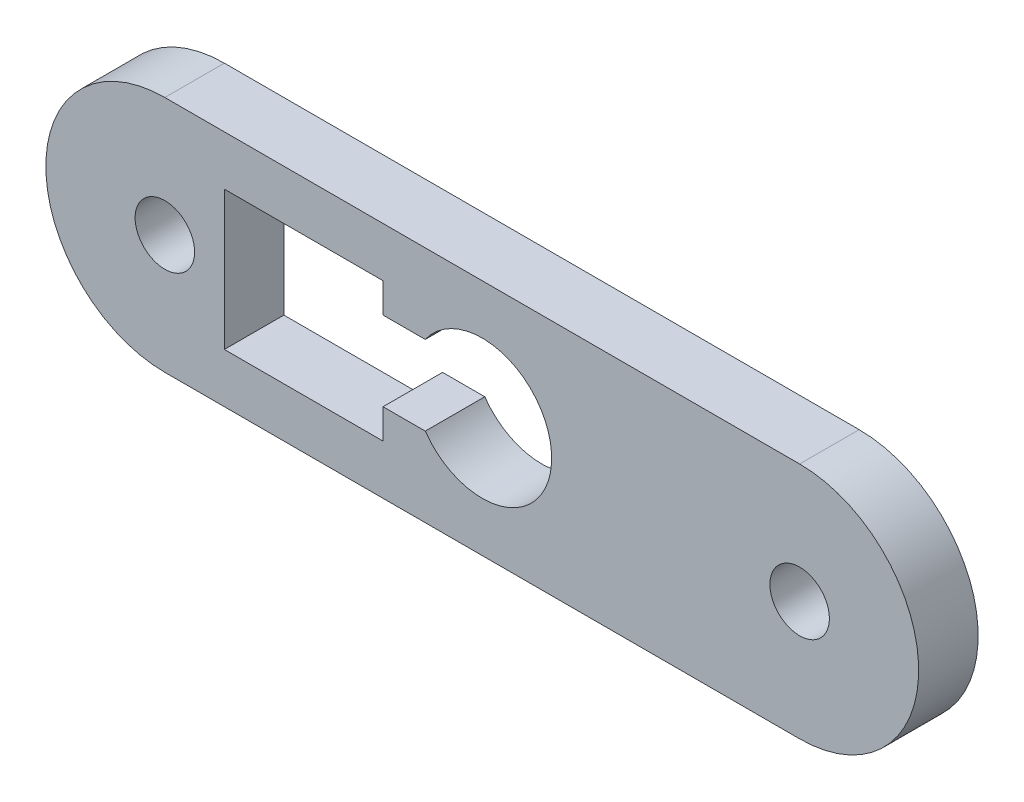
ISO-10303-21;
HEADER;
FILE_DESCRIPTION(('STEP AP214'),'2;1');
FILE_NAME('part.step','',(''),(''),'','','');
FILE_SCHEMA(('AUTOMOTIVE_DESIGN { 1 0 10303 214 1 1 1 1 }'));
ENDSEC;
DATA;
#1=APPLICATION_CONTEXT('core data for automotive mechanical design processes');
#2=APPLICATION_PROTOCOL_DEFINITION('international standard','automotive_design',2000,#1);
#3=PRODUCT_CONTEXT('',#1,'mechanical');
#4=PRODUCT('Part','Part','',(#3));
#5=PRODUCT_RELATED_PRODUCT_CATEGORY('part','',(#4));
#6=PRODUCT_DEFINITION_FORMATION('','',#4);
#7=PRODUCT_DEFINITION_CONTEXT('part definition',#1,'design');
#8=PRODUCT_DEFINITION('design','',#6,#7);
#9=PRODUCT_DEFINITION_SHAPE('','',#8);
#10=(LENGTH_UNIT() NAMED_UNIT(*) SI_UNIT(.MILLI.,.METRE.));
#11=(NAMED_UNIT(*) PLANE_ANGLE_UNIT() SI_UNIT($,.RADIAN.));
#12=(NAMED_UNIT(*) SI_UNIT($,.STERADIAN.) SOLID_ANGLE_UNIT());
#13=UNCERTAINTY_MEASURE_WITH_UNIT(LENGTH_MEASURE(1.E-05),#10,'distance_accuracy_value','');
#14=(GEOMETRIC_REPRESENTATION_CONTEXT(3) GLOBAL_UNCERTAINTY_ASSIGNED_CONTEXT((#13)) GLOBAL_UNIT_ASSIGNED_CONTEXT((#10,
#11,#12)) REPRESENTATION_CONTEXT('',''));
#15=CARTESIAN_POINT('',(0.,0.,0.));
#16=DIRECTION('',(0.,0.,1.));
#17=DIRECTION('',(1.,0.,0.));
#18=AXIS2_PLACEMENT_3D('',#15,#16,#17);
#19=CARTESIAN_POINT('',(0.,6.,3.));
#20=DIRECTION('',(0.,0.,1.));
#21=DIRECTION('',(1.,0.,0.));
#22=AXIS2_PLACEMENT_3D('',#19,#20,#21);
#23=PLANE('',#22);
#24=DIRECTION('',(0.,-1.,0.));
#25=VECTOR('',#24,1.);
#26=CARTESIAN_POINT('',(3.,9.5,3.));
#27=LINE('',#26,#25);
#28=CARTESIAN_POINT('',(3.,9.5,3.));
#29=VERTEX_POINT('',#28);
#30=CARTESIAN_POINT('',(3.,2.5,3.));
#31=VERTEX_POINT('',#30);
#32=EDGE_CURVE('E47',#29,#31,#27,.T.);
#33=ORIENTED_EDGE('',*,*,#32,.F.);
#34=DIRECTION('',(-1.,0.,0.));
#35=VECTOR('',#34,1.);
#36=CARTESIAN_POINT('',(3.,9.5,3.));
#37=LINE('',#36,#35);
#38=CARTESIAN_POINT('',(11.,9.5,3.));
#39=VERTEX_POINT('',#38);
#40=EDGE_CURVE('E140',#39,#29,#37,.T.);
#41=ORIENTED_EDGE('',*,*,#40,.F.);
#42=DIRECTION('',(0.,1.,0.));
#43=VECTOR('',#42,1.);
#44=CARTESIAN_POINT('',(11.,9.5,3.));
#45=LINE('',#44,#43);
#46=CARTESIAN_POINT('',(11.,8.,3.));
#47=VERTEX_POINT('',#46);
#48=EDGE_CURVE('E143',#47,#39,#45,.T.);
#49=ORIENTED_EDGE('',*,*,#48,.F.);
#50=DIRECTION('',(-1.,0.,0.));
#51=VECTOR('',#50,1.);
#52=CARTESIAN_POINT('',(11.,8.,3.));
#53=LINE('',#52,#51);
#54=CARTESIAN_POINT('',(13.127718676731,8.,3.));
#55=VERTEX_POINT('',#54);
#56=EDGE_CURVE('E171',#55,#47,#53,.T.);
#57=ORIENTED_EDGE('',*,*,#56,.F.);
#58=CARTESIAN_POINT('',(16.,6.,3.));
#59=DIRECTION('',(0.,0.,1.));
#60=DIRECTION('',(1.,0.,0.));
#61=AXIS2_PLACEMENT_3D('',#58,#59,#60);
#62=CIRCLE('',#61,3.5);
#63=CARTESIAN_POINT('',(13.127718676731,4.,3.));
#64=VERTEX_POINT('',#63);
#65=EDGE_CURVE('E168',#64,#55,#62,.T.);
#66=ORIENTED_EDGE('',*,*,#65,.F.);
#67=DIRECTION('',(1.,0.,0.));
#68=VECTOR('',#67,1.);
#69=CARTESIAN_POINT('',(11.,4.,3.));
#70=LINE('',#69,#68);
#71=CARTESIAN_POINT('',(11.,4.,3.));
#72=VERTEX_POINT('',#71);
#73=EDGE_CURVE('E165',#72,#64,#70,.T.);
#74=ORIENTED_EDGE('',*,*,#73,.F.);
#75=DIRECTION('',(0.,1.,0.));
#76=VECTOR('',#75,1.);
#77=CARTESIAN_POINT('',(11.,4.,3.));
#78=LINE('',#77,#76);
#79=CARTESIAN_POINT('',(11.,2.5,3.));
#80=VERTEX_POINT('',#79);
#81=EDGE_CURVE('E162',#80,#72,#78,.T.);
#82=ORIENTED_EDGE('',*,*,#81,.F.);
#83=DIRECTION('',(1.,0.,0.));
#84=VECTOR('',#83,1.);
#85=CARTESIAN_POINT('',(3.,2.5,3.));
#86=LINE('',#85,#84);
#87=EDGE_CURVE('E160',#31,#80,#86,.T.);
#88=ORIENTED_EDGE('',*,*,#87,.F.);
#89=EDGE_LOOP('',(#33,#41,#49,#57,#66,#74,#82,#88));
#90=FACE_BOUND('',#89,.T.);
#91=CARTESIAN_POINT('',(0.,6.,3.));
#92=DIRECTION('',(0.,0.,1.));
#93=DIRECTION('',(1.,0.,0.));
#94=AXIS2_PLACEMENT_3D('',#91,#92,#93);
#95=CIRCLE('',#94,1.5);
#96=CARTESIAN_POINT('',(1.5,6.,3.));
#97=VERTEX_POINT('',#96);
#98=EDGE_CURVE('E196',#97,#97,#95,.T.);
#99=ORIENTED_EDGE('',*,*,#98,.F.);
#100=EDGE_LOOP('',(#99));
#101=FACE_BOUND('',#100,.T.);
#102=CARTESIAN_POINT('',(0.,6.,3.));
#103=DIRECTION('',(0.,0.,1.));
#104=DIRECTION('',(1.,0.,0.));
#105=AXIS2_PLACEMENT_3D('',#102,#103,#104);
#106=CIRCLE('',#105,6.);
#107=CARTESIAN_POINT('',(0.,12.,3.));
#108=VERTEX_POINT('',#107);
#109=CARTESIAN_POINT('',(0.,0.,3.));
#110=VERTEX_POINT('',#109);
#111=EDGE_CURVE('E202',#108,#110,#106,.T.);
#112=ORIENTED_EDGE('',*,*,#111,.T.);
#113=DIRECTION('',(1.,0.,0.));
#114=VECTOR('',#113,1.);
#115=CARTESIAN_POINT('',(0.,0.,3.));
#116=LINE('',#115,#114);
#117=CARTESIAN_POINT('',(32.,0.,3.));
#118=VERTEX_POINT('',#117);
#119=EDGE_CURVE('E205',#110,#118,#116,.T.);
#120=ORIENTED_EDGE('',*,*,#119,.T.);
#121=CARTESIAN_POINT('',(32.,6.,3.));
#122=DIRECTION('',(0.,0.,1.));
#123=DIRECTION('',(-1.,0.,0.));
#124=AXIS2_PLACEMENT_3D('',#121,#122,#123);
#125=CIRCLE('',#124,6.);
#126=CARTESIAN_POINT('',(32.,12.,3.));
#127=VERTEX_POINT('',#126);
#128=EDGE_CURVE('E208',#118,#127,#125,.T.);
#129=ORIENTED_EDGE('',*,*,#128,.T.);
#130=DIRECTION('',(-1.,0.,0.));
#131=VECTOR('',#130,1.);
#132=CARTESIAN_POINT('',(0.,12.,3.));
#133=LINE('',#132,#131);
#134=EDGE_CURVE('E210',#127,#108,#133,.T.);
#135=ORIENTED_EDGE('',*,*,#134,.T.);
#136=EDGE_LOOP('',(#112,#120,#129,#135));
#137=FACE_BOUND('',#136,.T.);
#138=CARTESIAN_POINT('',(32.,6.,3.));
#139=DIRECTION('',(0.,0.,1.));
#140=DIRECTION('',(1.,0.,0.));
#141=AXIS2_PLACEMENT_3D('',#138,#139,#140);
#142=CIRCLE('',#141,1.5);
#143=CARTESIAN_POINT('',(33.5,6.,3.));
#144=VERTEX_POINT('',#143);
#145=EDGE_CURVE('E190',#144,#144,#142,.T.);
#146=ORIENTED_EDGE('',*,*,#145,.F.);
#147=EDGE_LOOP('',(#146));
#148=FACE_BOUND('',#147,.T.);
#149=ADVANCED_FACE('F32',(#90,#101,#137,#148),#23,.T.);
#150=CARTESIAN_POINT('',(0.,6.,0.));
#151=DIRECTION('',(0.,0.,1.));
#152=DIRECTION('',(1.,0.,0.));
#153=AXIS2_PLACEMENT_3D('',#150,#151,#152);
#154=PLANE('',#153);
#155=DIRECTION('',(-1.,0.,0.));
#156=VECTOR('',#155,1.);
#157=CARTESIAN_POINT('',(3.,9.5,0.));
#158=LINE('',#157,#156);
#159=CARTESIAN_POINT('',(11.,9.5,0.));
#160=VERTEX_POINT('',#159);
#161=CARTESIAN_POINT('',(3.,9.5,0.));
#162=VERTEX_POINT('',#161);
#163=EDGE_CURVE('E129',#160,#162,#158,.T.);
#164=ORIENTED_EDGE('',*,*,#163,.T.);
#165=DIRECTION('',(0.,-1.,0.));
#166=VECTOR('',#165,1.);
#167=CARTESIAN_POINT('',(3.,9.5,0.));
#168=LINE('',#167,#166);
#169=CARTESIAN_POINT('',(3.,2.5,0.));
#170=VERTEX_POINT('',#169);
#171=EDGE_CURVE('E123',#162,#170,#168,.T.);
#172=ORIENTED_EDGE('',*,*,#171,.T.);
#173=DIRECTION('',(1.,0.,0.));
#174=VECTOR('',#173,1.);
#175=CARTESIAN_POINT('',(3.,2.5,0.));
#176=LINE('',#175,#174);
#177=CARTESIAN_POINT('',(11.,2.5,0.));
#178=VERTEX_POINT('',#177);
#179=EDGE_CURVE('E132',#170,#178,#176,.T.);
#180=ORIENTED_EDGE('',*,*,#179,.T.);
#181=DIRECTION('',(0.,1.,0.));
#182=VECTOR('',#181,1.);
#183=CARTESIAN_POINT('',(11.,4.,0.));
#184=LINE('',#183,#182);
#185=CARTESIAN_POINT('',(11.,4.,0.));
#186=VERTEX_POINT('',#185);
#187=EDGE_CURVE('E55',#178,#186,#184,.T.);
#188=ORIENTED_EDGE('',*,*,#187,.T.);
#189=DIRECTION('',(1.,0.,0.));
#190=VECTOR('',#189,1.);
#191=CARTESIAN_POINT('',(11.,4.,0.));
#192=LINE('',#191,#190);
#193=CARTESIAN_POINT('',(13.127718676731,4.,0.));
#194=VERTEX_POINT('',#193);
#195=EDGE_CURVE('E147',#186,#194,#192,.T.);
#196=ORIENTED_EDGE('',*,*,#195,.T.);
#197=CARTESIAN_POINT('',(16.,6.,0.));
#198=DIRECTION('',(0.,0.,1.));
#199=DIRECTION('',(1.,0.,0.));
#200=AXIS2_PLACEMENT_3D('',#197,#198,#199);
#201=CIRCLE('',#200,3.5);
#202=CARTESIAN_POINT('',(13.127718676731,8.,0.));
#203=VERTEX_POINT('',#202);
#204=EDGE_CURVE('E150',#194,#203,#201,.T.);
#205=ORIENTED_EDGE('',*,*,#204,.T.);
#206=DIRECTION('',(-1.,0.,0.));
#207=VECTOR('',#206,1.);
#208=CARTESIAN_POINT('',(11.,8.,0.));
#209=LINE('',#208,#207);
#210=CARTESIAN_POINT('',(11.,8.,0.));
#211=VERTEX_POINT('',#210);
#212=EDGE_CURVE('E153',#203,#211,#209,.T.);
#213=ORIENTED_EDGE('',*,*,#212,.T.);
#214=DIRECTION('',(0.,1.,0.));
#215=VECTOR('',#214,1.);
#216=CARTESIAN_POINT('',(11.,9.5,0.));
#217=LINE('',#216,#215);
#218=EDGE_CURVE('E156',#211,#160,#217,.T.);
#219=ORIENTED_EDGE('',*,*,#218,.T.);
#220=EDGE_LOOP('',(#164,#172,#180,#188,#196,#205,#213,#219));
#221=FACE_BOUND('',#220,.T.);
#222=CARTESIAN_POINT('',(0.,6.,0.));
#223=DIRECTION('',(0.,0.,1.));
#224=DIRECTION('',(1.,0.,0.));
#225=AXIS2_PLACEMENT_3D('',#222,#223,#224);
#226=CIRCLE('',#225,6.);
#227=CARTESIAN_POINT('',(0.,12.,0.));
#228=VERTEX_POINT('',#227);
#229=CARTESIAN_POINT('',(0.,0.,0.));
#230=VERTEX_POINT('',#229);
#231=EDGE_CURVE('E199',#228,#230,#226,.T.);
#232=ORIENTED_EDGE('',*,*,#231,.F.);
#233=DIRECTION('',(-1.,0.,0.));
#234=VECTOR('',#233,1.);
#235=CARTESIAN_POINT('',(0.,12.,0.));
#236=LINE('',#235,#234);
#237=CARTESIAN_POINT('',(32.,12.,0.));
#238=VERTEX_POINT('',#237);
#239=EDGE_CURVE('E206',#238,#228,#236,.T.);
#240=ORIENTED_EDGE('',*,*,#239,.F.);
#241=CARTESIAN_POINT('',(32.,6.,0.));
#242=DIRECTION('',(0.,0.,1.));
#243=DIRECTION('',(-1.,0.,0.));
#244=AXIS2_PLACEMENT_3D('',#241,#242,#243);
#245=CIRCLE('',#244,6.);
#246=CARTESIAN_POINT('',(32.,0.,0.));
#247=VERTEX_POINT('',#246);
#248=EDGE_CURVE('E217',#247,#238,#245,.T.);
#249=ORIENTED_EDGE('',*,*,#248,.F.);
#250=DIRECTION('',(1.,0.,0.));
#251=VECTOR('',#250,1.);
#252=CARTESIAN_POINT('',(0.,0.,0.));
#253=LINE('',#252,#251);
#254=EDGE_CURVE('E215',#230,#247,#253,.T.);
#255=ORIENTED_EDGE('',*,*,#254,.F.);
#256=EDGE_LOOP('',(#232,#240,#249,#255));
#257=FACE_BOUND('',#256,.T.);
#258=CARTESIAN_POINT('',(0.,6.,0.));
#259=DIRECTION('',(0.,0.,1.));
#260=DIRECTION('',(1.,0.,0.));
#261=AXIS2_PLACEMENT_3D('',#258,#259,#260);
#262=CIRCLE('',#261,1.5);
#263=CARTESIAN_POINT('',(1.5,6.,0.));
#264=VERTEX_POINT('',#263);
#265=EDGE_CURVE('E193',#264,#264,#262,.T.);
#266=ORIENTED_EDGE('',*,*,#265,.T.);
#267=EDGE_LOOP('',(#266));
#268=FACE_BOUND('',#267,.T.);
#269=CARTESIAN_POINT('',(32.,6.,0.));
#270=DIRECTION('',(0.,0.,1.));
#271=DIRECTION('',(1.,0.,0.));
#272=AXIS2_PLACEMENT_3D('',#269,#270,#271);
#273=CIRCLE('',#272,1.5);
#274=CARTESIAN_POINT('',(33.5,6.,0.));
#275=VERTEX_POINT('',#274);
#276=EDGE_CURVE('E178',#275,#275,#273,.T.);
#277=ORIENTED_EDGE('',*,*,#276,.T.);
#278=EDGE_LOOP('',(#277));
#279=FACE_BOUND('',#278,.T.);
#280=ADVANCED_FACE('F136',(#221,#257,#268,#279),#154,.F.);
#281=CARTESIAN_POINT('',(0.,6.,3.));
#282=DIRECTION('',(0.,0.,-1.));
#283=DIRECTION('',(-1.,0.,0.));
#284=AXIS2_PLACEMENT_3D('',#281,#282,#283);
#285=CYLINDRICAL_SURFACE('',#284,6.);
#286=ORIENTED_EDGE('',*,*,#231,.T.);
#287=DIRECTION('',(0.,0.,-1.));
#288=VECTOR('',#287,1.);
#289=CARTESIAN_POINT('',(0.,0.,3.));
#290=LINE('',#289,#288);
#291=EDGE_CURVE('E11',#110,#230,#290,.T.);
#292=ORIENTED_EDGE('',*,*,#291,.F.);
#293=ORIENTED_EDGE('',*,*,#111,.F.);
#294=DIRECTION('',(0.,0.,-1.));
#295=VECTOR('',#294,1.);
#296=CARTESIAN_POINT('',(0.,12.,3.));
#297=LINE('',#296,#295);
#298=EDGE_CURVE('E212',#108,#228,#297,.T.);
#299=ORIENTED_EDGE('',*,*,#298,.T.);
#300=EDGE_LOOP('',(#286,#292,#293,#299));
#301=FACE_BOUND('',#300,.T.);
#302=ADVANCED_FACE('F34',(#301),#285,.T.);
#303=CARTESIAN_POINT('',(0.,0.,3.));
#304=DIRECTION('',(0.,1.,0.));
#305=DIRECTION('',(0.,0.,1.));
#306=AXIS2_PLACEMENT_3D('',#303,#304,#305);
#307=PLANE('',#306);
#308=ORIENTED_EDGE('',*,*,#254,.T.);
#309=DIRECTION('',(0.,0.,-1.));
#310=VECTOR('',#309,1.);
#311=CARTESIAN_POINT('',(32.,0.,3.));
#312=LINE('',#311,#310);
#313=EDGE_CURVE('E40',#118,#247,#312,.T.);
#314=ORIENTED_EDGE('',*,*,#313,.F.);
#315=ORIENTED_EDGE('',*,*,#119,.F.);
#316=ORIENTED_EDGE('',*,*,#291,.T.);
#317=EDGE_LOOP('',(#308,#314,#315,#316));
#318=FACE_BOUND('',#317,.T.);
#319=ADVANCED_FACE('F244',(#318),#307,.F.);
#320=CARTESIAN_POINT('',(32.,6.,3.));
#321=DIRECTION('',(0.,0.,-1.));
#322=DIRECTION('',(-1.,0.,0.));
#323=AXIS2_PLACEMENT_3D('',#320,#321,#322);
#324=CYLINDRICAL_SURFACE('',#323,6.);
#325=ORIENTED_EDGE('',*,*,#248,.T.);
#326=DIRECTION('',(0.,0.,-1.));
#327=VECTOR('',#326,1.);
#328=CARTESIAN_POINT('',(32.,12.,3.));
#329=LINE('',#328,#327);
#330=EDGE_CURVE('E222',#127,#238,#329,.T.);
#331=ORIENTED_EDGE('',*,*,#330,.F.);
#332=ORIENTED_EDGE('',*,*,#128,.F.);
#333=ORIENTED_EDGE('',*,*,#313,.T.);
#334=EDGE_LOOP('',(#325,#331,#332,#333));
#335=FACE_BOUND('',#334,.T.);
#336=ADVANCED_FACE('F229',(#335),#324,.T.);
#337=CARTESIAN_POINT('',(0.,12.,3.));
#338=DIRECTION('',(0.,-1.,0.));
#339=DIRECTION('',(0.,0.,-1.));
#340=AXIS2_PLACEMENT_3D('',#337,#338,#339);
#341=PLANE('',#340);
#342=ORIENTED_EDGE('',*,*,#239,.T.);
#343=ORIENTED_EDGE('',*,*,#298,.F.);
#344=ORIENTED_EDGE('',*,*,#134,.F.);
#345=ORIENTED_EDGE('',*,*,#330,.T.);
#346=EDGE_LOOP('',(#342,#343,#344,#345));
#347=FACE_BOUND('',#346,.T.);
#348=ADVANCED_FACE('F237',(#347),#341,.F.);
#349=CARTESIAN_POINT('',(0.,6.,3.));
#350=DIRECTION('',(0.,0.,-1.));
#351=DIRECTION('',(-1.,0.,0.));
#352=AXIS2_PLACEMENT_3D('',#349,#350,#351);
#353=CYLINDRICAL_SURFACE('',#352,1.5);
#354=ORIENTED_EDGE('',*,*,#98,.T.);
#355=EDGE_LOOP('',(#354));
#356=FACE_BOUND('',#355,.T.);
#357=ORIENTED_EDGE('',*,*,#265,.F.);
#358=EDGE_LOOP('',(#357));
#359=FACE_BOUND('',#358,.T.);
#360=ADVANCED_FACE('F260',(#356,#359),#353,.F.);
#361=CARTESIAN_POINT('',(32.,6.,3.));
#362=DIRECTION('',(0.,0.,-1.));
#363=DIRECTION('',(-1.,0.,0.));
#364=AXIS2_PLACEMENT_3D('',#361,#362,#363);
#365=CYLINDRICAL_SURFACE('',#364,1.5);
#366=ORIENTED_EDGE('',*,*,#145,.T.);
#367=EDGE_LOOP('',(#366));
#368=FACE_BOUND('',#367,.T.);
#369=ORIENTED_EDGE('',*,*,#276,.F.);
#370=EDGE_LOOP('',(#369));
#371=FACE_BOUND('',#370,.T.);
#372=ADVANCED_FACE('F267',(#368,#371),#365,.F.);
#373=CARTESIAN_POINT('',(3.,9.5,0.));
#374=DIRECTION('',(-1.,0.,0.));
#375=DIRECTION('',(0.,-1.,0.));
#376=AXIS2_PLACEMENT_3D('',#373,#374,#375);
#377=PLANE('',#376);
#378=ORIENTED_EDGE('',*,*,#32,.T.);
#379=DIRECTION('',(0.,0.,1.));
#380=VECTOR('',#379,1.);
#381=CARTESIAN_POINT('',(3.,2.5,0.));
#382=LINE('',#381,#380);
#383=EDGE_CURVE('E119',#170,#31,#382,.T.);
#384=ORIENTED_EDGE('',*,*,#383,.F.);
#385=ORIENTED_EDGE('',*,*,#171,.F.);
#386=DIRECTION('',(0.,0.,1.));
#387=VECTOR('',#386,1.);
#388=CARTESIAN_POINT('',(3.,9.5,0.));
#389=LINE('',#388,#387);
#390=EDGE_CURVE('E176',#162,#29,#389,.T.);
#391=ORIENTED_EDGE('',*,*,#390,.T.);
#392=EDGE_LOOP('',(#378,#384,#385,#391));
#393=FACE_BOUND('',#392,.T.);
#394=ADVANCED_FACE('F121',(#393),#377,.F.);
#395=CARTESIAN_POINT('',(3.,9.5,0.));
#396=DIRECTION('',(0.,1.,0.));
#397=DIRECTION('',(-1.,0.,0.));
#398=AXIS2_PLACEMENT_3D('',#395,#396,#397);
#399=PLANE('',#398);
#400=ORIENTED_EDGE('',*,*,#40,.T.);
#401=ORIENTED_EDGE('',*,*,#390,.F.);
#402=ORIENTED_EDGE('',*,*,#163,.F.);
#403=DIRECTION('',(0.,0.,1.));
#404=VECTOR('',#403,1.);
#405=CARTESIAN_POINT('',(11.,9.5,0.));
#406=LINE('',#405,#404);
#407=EDGE_CURVE('E179',#160,#39,#406,.T.);
#408=ORIENTED_EDGE('',*,*,#407,.T.);
#409=EDGE_LOOP('',(#400,#401,#402,#408));
#410=FACE_BOUND('',#409,.T.);
#411=ADVANCED_FACE('F282',(#410),#399,.F.);
#412=CARTESIAN_POINT('',(11.,9.5,0.));
#413=DIRECTION('',(1.,0.,0.));
#414=DIRECTION('',(0.,1.,0.));
#415=AXIS2_PLACEMENT_3D('',#412,#413,#414);
#416=PLANE('',#415);
#417=ORIENTED_EDGE('',*,*,#48,.T.);
#418=ORIENTED_EDGE('',*,*,#407,.F.);
#419=ORIENTED_EDGE('',*,*,#218,.F.);
#420=DIRECTION('',(0.,0.,1.));
#421=VECTOR('',#420,1.);
#422=CARTESIAN_POINT('',(11.,8.,0.));
#423=LINE('',#422,#421);
#424=EDGE_CURVE('E181',#211,#47,#423,.T.);
#425=ORIENTED_EDGE('',*,*,#424,.T.);
#426=EDGE_LOOP('',(#417,#418,#419,#425));
#427=FACE_BOUND('',#426,.T.);
#428=ADVANCED_FACE('F301',(#427),#416,.F.);
#429=CARTESIAN_POINT('',(11.,8.,0.));
#430=DIRECTION('',(0.,1.,0.));
#431=DIRECTION('',(0.,0.,1.));
#432=AXIS2_PLACEMENT_3D('',#429,#430,#431);
#433=PLANE('',#432);
#434=ORIENTED_EDGE('',*,*,#56,.T.);
#435=ORIENTED_EDGE('',*,*,#424,.F.);
#436=ORIENTED_EDGE('',*,*,#212,.F.);
#437=DIRECTION('',(0.,0.,1.));
#438=VECTOR('',#437,1.);
#439=CARTESIAN_POINT('',(13.127718676731,8.,0.));
#440=LINE('',#439,#438);
#441=EDGE_CURVE('E183',#203,#55,#440,.T.);
#442=ORIENTED_EDGE('',*,*,#441,.T.);
#443=EDGE_LOOP('',(#434,#435,#436,#442));
#444=FACE_BOUND('',#443,.T.);
#445=ADVANCED_FACE('F297',(#444),#433,.F.);
#446=CARTESIAN_POINT('',(16.,6.,0.));
#447=DIRECTION('',(0.,0.,1.));
#448=DIRECTION('',(1.,0.,0.));
#449=AXIS2_PLACEMENT_3D('',#446,#447,#448);
#450=CYLINDRICAL_SURFACE('',#449,3.5);
#451=ORIENTED_EDGE('',*,*,#65,.T.);
#452=ORIENTED_EDGE('',*,*,#441,.F.);
#453=ORIENTED_EDGE('',*,*,#204,.F.);
#454=DIRECTION('',(0.,0.,1.));
#455=VECTOR('',#454,1.);
#456=CARTESIAN_POINT('',(13.127718676731,4.,0.));
#457=LINE('',#456,#455);
#458=EDGE_CURVE('E185',#194,#64,#457,.T.);
#459=ORIENTED_EDGE('',*,*,#458,.T.);
#460=EDGE_LOOP('',(#451,#452,#453,#459));
#461=FACE_BOUND('',#460,.T.);
#462=ADVANCED_FACE('F293',(#461),#450,.F.);
#463=CARTESIAN_POINT('',(11.,4.,0.));
#464=DIRECTION('',(0.,-1.,0.));
#465=DIRECTION('',(0.,0.,-1.));
#466=AXIS2_PLACEMENT_3D('',#463,#464,#465);
#467=PLANE('',#466);
#468=ORIENTED_EDGE('',*,*,#73,.T.);
#469=ORIENTED_EDGE('',*,*,#458,.F.);
#470=ORIENTED_EDGE('',*,*,#195,.F.);
#471=DIRECTION('',(0.,0.,1.));
#472=VECTOR('',#471,1.);
#473=CARTESIAN_POINT('',(11.,4.,0.));
#474=LINE('',#473,#472);
#475=EDGE_CURVE('E187',#186,#72,#474,.T.);
#476=ORIENTED_EDGE('',*,*,#475,.T.);
#477=EDGE_LOOP('',(#468,#469,#470,#476));
#478=FACE_BOUND('',#477,.T.);
#479=ADVANCED_FACE('F290',(#478),#467,.F.);
#480=CARTESIAN_POINT('',(11.,4.,0.));
#481=DIRECTION('',(1.,0.,0.));
#482=DIRECTION('',(0.,1.,0.));
#483=AXIS2_PLACEMENT_3D('',#480,#481,#482);
#484=PLANE('',#483);
#485=ORIENTED_EDGE('',*,*,#81,.T.);
#486=ORIENTED_EDGE('',*,*,#475,.F.);
#487=ORIENTED_EDGE('',*,*,#187,.F.);
#488=DIRECTION('',(0.,0.,1.));
#489=VECTOR('',#488,1.);
#490=CARTESIAN_POINT('',(11.,2.5,0.));
#491=LINE('',#490,#489);
#492=EDGE_CURVE('E128',#178,#80,#491,.T.);
#493=ORIENTED_EDGE('',*,*,#492,.T.);
#494=EDGE_LOOP('',(#485,#486,#487,#493));
#495=FACE_BOUND('',#494,.T.);
#496=ADVANCED_FACE('F287',(#495),#484,.F.);
#497=CARTESIAN_POINT('',(3.,2.5,0.));
#498=DIRECTION('',(0.,-1.,0.));
#499=DIRECTION('',(0.,0.,-1.));
#500=AXIS2_PLACEMENT_3D('',#497,#498,#499);
#501=PLANE('',#500);
#502=ORIENTED_EDGE('',*,*,#87,.T.);
#503=ORIENTED_EDGE('',*,*,#492,.F.);
#504=ORIENTED_EDGE('',*,*,#179,.F.);
#505=ORIENTED_EDGE('',*,*,#383,.T.);
#506=EDGE_LOOP('',(#502,#503,#504,#505));
#507=FACE_BOUND('',#506,.T.);
#508=ADVANCED_FACE('F133',(#507),#501,.F.);
#509=CLOSED_SHELL('',(#149,#280,#302,#319,#336,#348,#360,#372,#394,#411,#428,#445,#462,#479,
#496,#508));
#510=MANIFOLD_SOLID_BREP('B2',#509);
#511=ADVANCED_BREP_SHAPE_REPRESENTATION('',(#18,#510),#14);
#512=SHAPE_DEFINITION_REPRESENTATION(#9,#511);
ENDSEC;
END-ISO-10303-21;
